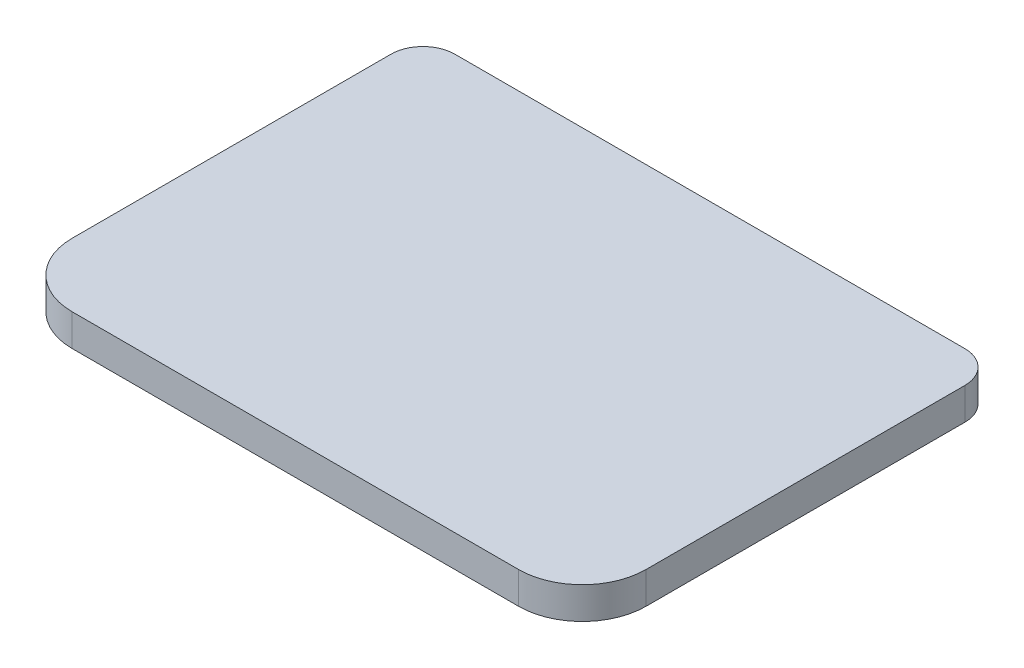
ISO-10303-21;
HEADER;
FILE_DESCRIPTION(('STEP AP214'),'2;1');
FILE_NAME('part.step','',(''),(''),'','','');
FILE_SCHEMA(('AUTOMOTIVE_DESIGN { 1 0 10303 214 1 1 1 1 }'));
ENDSEC;
DATA;
#1=APPLICATION_CONTEXT('core data for automotive mechanical design processes');
#2=APPLICATION_PROTOCOL_DEFINITION('international standard','automotive_design',2000,#1);
#3=PRODUCT_CONTEXT('',#1,'mechanical');
#4=PRODUCT('Part','Part','',(#3));
#5=PRODUCT_RELATED_PRODUCT_CATEGORY('part','',(#4));
#6=PRODUCT_DEFINITION_FORMATION('','',#4);
#7=PRODUCT_DEFINITION_CONTEXT('part definition',#1,'design');
#8=PRODUCT_DEFINITION('design','',#6,#7);
#9=PRODUCT_DEFINITION_SHAPE('','',#8);
#10=(LENGTH_UNIT() NAMED_UNIT(*) SI_UNIT(.MILLI.,.METRE.));
#11=(NAMED_UNIT(*) PLANE_ANGLE_UNIT() SI_UNIT($,.RADIAN.));
#12=(NAMED_UNIT(*) SI_UNIT($,.STERADIAN.) SOLID_ANGLE_UNIT());
#13=UNCERTAINTY_MEASURE_WITH_UNIT(LENGTH_MEASURE(1.E-05),#10,'distance_accuracy_value','');
#14=(GEOMETRIC_REPRESENTATION_CONTEXT(3) GLOBAL_UNCERTAINTY_ASSIGNED_CONTEXT((#13)) GLOBAL_UNIT_ASSIGNED_CONTEXT((#10,
#11,#12)) REPRESENTATION_CONTEXT('',''));
#15=CARTESIAN_POINT('',(0.,0.,0.));
#16=DIRECTION('',(0.,0.,1.));
#17=DIRECTION('',(1.,0.,0.));
#18=AXIS2_PLACEMENT_3D('',#15,#16,#17);
#19=CARTESIAN_POINT('',(28.575,3.175,-20.6375));
#20=DIRECTION('',(-1.,0.,0.));
#21=DIRECTION('',(0.,0.,1.));
#22=AXIS2_PLACEMENT_3D('',#19,#20,#21);
#23=PLANE('',#22);
#24=DIRECTION('',(0.,0.,-1.));
#25=VECTOR('',#24,1.);
#26=CARTESIAN_POINT('',(28.575,0.,-20.6375));
#27=LINE('',#26,#25);
#28=CARTESIAN_POINT('',(28.575,0.,14.2875));
#29=VERTEX_POINT('',#28);
#30=CARTESIAN_POINT('',(28.575,0.,-17.4625));
#31=VERTEX_POINT('',#30);
#32=EDGE_CURVE('E120',#29,#31,#27,.T.);
#33=ORIENTED_EDGE('',*,*,#32,.T.);
#34=DIRECTION('',(0.,-1.,0.));
#35=VECTOR('',#34,1.);
#36=CARTESIAN_POINT('',(28.575,3.175,-17.4625));
#37=LINE('',#36,#35);
#38=CARTESIAN_POINT('',(28.575,3.175,-17.4625));
#39=VERTEX_POINT('',#38);
#40=EDGE_CURVE('E62',#31,#39,#37,.F.);
#41=ORIENTED_EDGE('',*,*,#40,.T.);
#42=DIRECTION('',(0.,0.,-1.));
#43=VECTOR('',#42,1.);
#44=CARTESIAN_POINT('',(28.575,3.175,-20.6375));
#45=LINE('',#44,#43);
#46=CARTESIAN_POINT('',(28.575,3.175,14.2875));
#47=VERTEX_POINT('',#46);
#48=EDGE_CURVE('E121',#47,#39,#45,.T.);
#49=ORIENTED_EDGE('',*,*,#48,.F.);
#50=DIRECTION('',(0.,-1.,0.));
#51=VECTOR('',#50,1.);
#52=CARTESIAN_POINT('',(28.575,3.175,14.2875));
#53=LINE('',#52,#51);
#54=EDGE_CURVE('E111',#47,#29,#53,.T.);
#55=ORIENTED_EDGE('',*,*,#54,.T.);
#56=EDGE_LOOP('',(#33,#41,#49,#55));
#57=FACE_BOUND('',#56,.T.);
#58=ADVANCED_FACE('F39',(#57),#23,.F.);
#59=CARTESIAN_POINT('',(-28.575,3.175,-20.6375));
#60=DIRECTION('',(0.,0.,1.));
#61=DIRECTION('',(1.,0.,0.));
#62=AXIS2_PLACEMENT_3D('',#59,#60,#61);
#63=PLANE('',#62);
#64=DIRECTION('',(-1.,0.,0.));
#65=VECTOR('',#64,1.);
#66=CARTESIAN_POINT('',(-28.575,3.175,-20.6375));
#67=LINE('',#66,#65);
#68=CARTESIAN_POINT('',(25.4,3.175,-20.6375));
#69=VERTEX_POINT('',#68);
#70=CARTESIAN_POINT('',(-25.4,3.175,-20.6375));
#71=VERTEX_POINT('',#70);
#72=EDGE_CURVE('E162',#69,#71,#67,.T.);
#73=ORIENTED_EDGE('',*,*,#72,.F.);
#74=DIRECTION('',(0.,-1.,0.));
#75=VECTOR('',#74,1.);
#76=CARTESIAN_POINT('',(25.4,3.175,-20.6375));
#77=LINE('',#76,#75);
#78=CARTESIAN_POINT('',(25.4,0.,-20.6375));
#79=VERTEX_POINT('',#78);
#80=EDGE_CURVE('E152',#69,#79,#77,.T.);
#81=ORIENTED_EDGE('',*,*,#80,.T.);
#82=DIRECTION('',(-1.,0.,0.));
#83=VECTOR('',#82,1.);
#84=CARTESIAN_POINT('',(-28.575,0.,-20.6375));
#85=LINE('',#84,#83);
#86=CARTESIAN_POINT('',(-25.4,0.,-20.6375));
#87=VERTEX_POINT('',#86);
#88=EDGE_CURVE('E127',#79,#87,#85,.T.);
#89=ORIENTED_EDGE('',*,*,#88,.T.);
#90=DIRECTION('',(0.,-1.,0.));
#91=VECTOR('',#90,1.);
#92=CARTESIAN_POINT('',(-25.4,3.175,-20.6375));
#93=LINE('',#92,#91);
#94=EDGE_CURVE('E150',#87,#71,#93,.F.);
#95=ORIENTED_EDGE('',*,*,#94,.T.);
#96=EDGE_LOOP('',(#73,#81,#89,#95));
#97=FACE_BOUND('',#96,.T.);
#98=ADVANCED_FACE('F166',(#97),#63,.F.);
#99=CARTESIAN_POINT('',(-28.575,3.175,-20.6375));
#100=DIRECTION('',(1.,0.,0.));
#101=DIRECTION('',(0.,0.,-1.));
#102=AXIS2_PLACEMENT_3D('',#99,#100,#101);
#103=PLANE('',#102);
#104=DIRECTION('',(0.,0.,1.));
#105=VECTOR('',#104,1.);
#106=CARTESIAN_POINT('',(-28.575,3.175,-20.6375));
#107=LINE('',#106,#105);
#108=CARTESIAN_POINT('',(-28.575,3.175,-17.4625));
#109=VERTEX_POINT('',#108);
#110=CARTESIAN_POINT('',(-28.575,3.175,14.2875));
#111=VERTEX_POINT('',#110);
#112=EDGE_CURVE('E168',#109,#111,#107,.T.);
#113=ORIENTED_EDGE('',*,*,#112,.F.);
#114=DIRECTION('',(0.,-1.,0.));
#115=VECTOR('',#114,1.);
#116=CARTESIAN_POINT('',(-28.575,3.175,-17.4625));
#117=LINE('',#116,#115);
#118=CARTESIAN_POINT('',(-28.575,0.,-17.4625));
#119=VERTEX_POINT('',#118);
#120=EDGE_CURVE('E11',#109,#119,#117,.T.);
#121=ORIENTED_EDGE('',*,*,#120,.T.);
#122=DIRECTION('',(0.,0.,1.));
#123=VECTOR('',#122,1.);
#124=CARTESIAN_POINT('',(-28.575,0.,-20.6375));
#125=LINE('',#124,#123);
#126=CARTESIAN_POINT('',(-28.575,0.,14.2875));
#127=VERTEX_POINT('',#126);
#128=EDGE_CURVE('E130',#119,#127,#125,.T.);
#129=ORIENTED_EDGE('',*,*,#128,.T.);
#130=DIRECTION('',(0.,-1.,0.));
#131=VECTOR('',#130,1.);
#132=CARTESIAN_POINT('',(-28.575,3.175,14.2875));
#133=LINE('',#132,#131);
#134=EDGE_CURVE('E147',#127,#111,#133,.F.);
#135=ORIENTED_EDGE('',*,*,#134,.T.);
#136=EDGE_LOOP('',(#113,#121,#129,#135));
#137=FACE_BOUND('',#136,.T.);
#138=ADVANCED_FACE('F186',(#137),#103,.F.);
#139=CARTESIAN_POINT('',(-28.575,3.175,20.6375));
#140=DIRECTION('',(0.,0.,-1.));
#141=DIRECTION('',(-1.,0.,0.));
#142=AXIS2_PLACEMENT_3D('',#139,#140,#141);
#143=PLANE('',#142);
#144=DIRECTION('',(1.,0.,0.));
#145=VECTOR('',#144,1.);
#146=CARTESIAN_POINT('',(-28.575,0.,20.6375));
#147=LINE('',#146,#145);
#148=CARTESIAN_POINT('',(-22.225,0.,20.6375));
#149=VERTEX_POINT('',#148);
#150=CARTESIAN_POINT('',(22.225,0.,20.6375));
#151=VERTEX_POINT('',#150);
#152=EDGE_CURVE('E136',#149,#151,#147,.T.);
#153=ORIENTED_EDGE('',*,*,#152,.T.);
#154=DIRECTION('',(0.,-1.,0.));
#155=VECTOR('',#154,1.);
#156=CARTESIAN_POINT('',(22.225,3.175,20.6375));
#157=LINE('',#156,#155);
#158=CARTESIAN_POINT('',(22.225,3.175,20.6375));
#159=VERTEX_POINT('',#158);
#160=EDGE_CURVE('E112',#151,#159,#157,.F.);
#161=ORIENTED_EDGE('',*,*,#160,.T.);
#162=DIRECTION('',(1.,0.,0.));
#163=VECTOR('',#162,1.);
#164=CARTESIAN_POINT('',(-28.575,3.175,20.6375));
#165=LINE('',#164,#163);
#166=CARTESIAN_POINT('',(-22.225,3.175,20.6375));
#167=VERTEX_POINT('',#166);
#168=EDGE_CURVE('E122',#167,#159,#165,.T.);
#169=ORIENTED_EDGE('',*,*,#168,.F.);
#170=DIRECTION('',(0.,-1.,0.));
#171=VECTOR('',#170,1.);
#172=CARTESIAN_POINT('',(-22.225,3.175,20.6375));
#173=LINE('',#172,#171);
#174=EDGE_CURVE('E117',#167,#149,#173,.T.);
#175=ORIENTED_EDGE('',*,*,#174,.T.);
#176=EDGE_LOOP('',(#153,#161,#169,#175));
#177=FACE_BOUND('',#176,.T.);
#178=ADVANCED_FACE('F198',(#177),#143,.F.);
#179=CARTESIAN_POINT('',(0.,3.175,0.));
#180=DIRECTION('',(0.,1.,0.));
#181=DIRECTION('',(0.,0.,1.));
#182=AXIS2_PLACEMENT_3D('',#179,#180,#181);
#183=PLANE('',#182);
#184=ORIENTED_EDGE('',*,*,#48,.T.);
#185=CARTESIAN_POINT('',(25.4,3.175,-17.4625));
#186=DIRECTION('',(0.,1.,0.));
#187=DIRECTION('',(0.,0.,1.));
#188=AXIS2_PLACEMENT_3D('',#185,#186,#187);
#189=CIRCLE('',#188,3.175);
#190=EDGE_CURVE('E47',#39,#69,#189,.T.);
#191=ORIENTED_EDGE('',*,*,#190,.T.);
#192=ORIENTED_EDGE('',*,*,#72,.T.);
#193=CARTESIAN_POINT('',(-25.4,3.175,-17.4625));
#194=DIRECTION('',(0.,1.,0.));
#195=DIRECTION('',(0.,0.,1.));
#196=AXIS2_PLACEMENT_3D('',#193,#194,#195);
#197=CIRCLE('',#196,3.175);
#198=EDGE_CURVE('E54',#71,#109,#197,.T.);
#199=ORIENTED_EDGE('',*,*,#198,.T.);
#200=ORIENTED_EDGE('',*,*,#112,.T.);
#201=CARTESIAN_POINT('',(-22.225,3.175,14.2875));
#202=DIRECTION('',(0.,1.,0.));
#203=DIRECTION('',(0.,0.,1.));
#204=AXIS2_PLACEMENT_3D('',#201,#202,#203);
#205=CIRCLE('',#204,6.35);
#206=EDGE_CURVE('E143',#111,#167,#205,.T.);
#207=ORIENTED_EDGE('',*,*,#206,.T.);
#208=ORIENTED_EDGE('',*,*,#168,.T.);
#209=CARTESIAN_POINT('',(22.225,3.175,14.2875));
#210=DIRECTION('',(0.,1.,0.));
#211=DIRECTION('',(0.,0.,1.));
#212=AXIS2_PLACEMENT_3D('',#209,#210,#211);
#213=CIRCLE('',#212,6.35);
#214=EDGE_CURVE('E145',#159,#47,#213,.T.);
#215=ORIENTED_EDGE('',*,*,#214,.T.);
#216=EDGE_LOOP('',(#184,#191,#192,#199,#200,#207,#208,#215));
#217=FACE_BOUND('',#216,.T.);
#218=ADVANCED_FACE('F161',(#217),#183,.T.);
#219=CARTESIAN_POINT('',(0.,0.,0.));
#220=DIRECTION('',(0.,1.,0.));
#221=DIRECTION('',(0.,0.,1.));
#222=AXIS2_PLACEMENT_3D('',#219,#220,#221);
#223=PLANE('',#222);
#224=ORIENTED_EDGE('',*,*,#88,.F.);
#225=CARTESIAN_POINT('',(25.4,0.,-17.4625));
#226=DIRECTION('',(0.,1.,0.));
#227=DIRECTION('',(0.,0.,1.));
#228=AXIS2_PLACEMENT_3D('',#225,#226,#227);
#229=CIRCLE('',#228,3.175);
#230=EDGE_CURVE('E126',#79,#31,#229,.F.);
#231=ORIENTED_EDGE('',*,*,#230,.T.);
#232=ORIENTED_EDGE('',*,*,#32,.F.);
#233=CARTESIAN_POINT('',(22.225,0.,14.2875));
#234=DIRECTION('',(0.,1.,0.));
#235=DIRECTION('',(0.,0.,1.));
#236=AXIS2_PLACEMENT_3D('',#233,#234,#235);
#237=CIRCLE('',#236,6.35);
#238=EDGE_CURVE('E107',#29,#151,#237,.F.);
#239=ORIENTED_EDGE('',*,*,#238,.T.);
#240=ORIENTED_EDGE('',*,*,#152,.F.);
#241=CARTESIAN_POINT('',(-22.225,0.,14.2875));
#242=DIRECTION('',(0.,1.,0.));
#243=DIRECTION('',(0.,0.,1.));
#244=AXIS2_PLACEMENT_3D('',#241,#242,#243);
#245=CIRCLE('',#244,6.35);
#246=EDGE_CURVE('E118',#149,#127,#245,.F.);
#247=ORIENTED_EDGE('',*,*,#246,.T.);
#248=ORIENTED_EDGE('',*,*,#128,.F.);
#249=CARTESIAN_POINT('',(-25.4,0.,-17.4625));
#250=DIRECTION('',(0.,1.,0.));
#251=DIRECTION('',(0.,0.,1.));
#252=AXIS2_PLACEMENT_3D('',#249,#250,#251);
#253=CIRCLE('',#252,3.175);
#254=EDGE_CURVE('E155',#119,#87,#253,.F.);
#255=ORIENTED_EDGE('',*,*,#254,.T.);
#256=EDGE_LOOP('',(#224,#231,#232,#239,#240,#247,#248,#255));
#257=FACE_BOUND('',#256,.T.);
#258=ADVANCED_FACE('F125',(#257),#223,.F.);
#259=CARTESIAN_POINT('',(22.225,3.175,14.2875));
#260=DIRECTION('',(0.,-1.,0.));
#261=DIRECTION('',(0.,0.,-1.));
#262=AXIS2_PLACEMENT_3D('',#259,#260,#261);
#263=CYLINDRICAL_SURFACE('',#262,6.35);
#264=ORIENTED_EDGE('',*,*,#214,.F.);
#265=ORIENTED_EDGE('',*,*,#160,.F.);
#266=ORIENTED_EDGE('',*,*,#238,.F.);
#267=ORIENTED_EDGE('',*,*,#54,.F.);
#268=EDGE_LOOP('',(#264,#265,#266,#267));
#269=FACE_BOUND('',#268,.T.);
#270=ADVANCED_FACE('F110',(#269),#263,.T.);
#271=CARTESIAN_POINT('',(-22.225,3.175,14.2875));
#272=DIRECTION('',(0.,-1.,0.));
#273=DIRECTION('',(0.,0.,-1.));
#274=AXIS2_PLACEMENT_3D('',#271,#272,#273);
#275=CYLINDRICAL_SURFACE('',#274,6.35);
#276=ORIENTED_EDGE('',*,*,#206,.F.);
#277=ORIENTED_EDGE('',*,*,#134,.F.);
#278=ORIENTED_EDGE('',*,*,#246,.F.);
#279=ORIENTED_EDGE('',*,*,#174,.F.);
#280=EDGE_LOOP('',(#276,#277,#278,#279));
#281=FACE_BOUND('',#280,.T.);
#282=ADVANCED_FACE('F172',(#281),#275,.T.);
#283=CARTESIAN_POINT('',(25.4,3.175,-17.4625));
#284=DIRECTION('',(0.,-1.,0.));
#285=DIRECTION('',(0.,0.,-1.));
#286=AXIS2_PLACEMENT_3D('',#283,#284,#285);
#287=CYLINDRICAL_SURFACE('',#286,3.175);
#288=ORIENTED_EDGE('',*,*,#190,.F.);
#289=ORIENTED_EDGE('',*,*,#40,.F.);
#290=ORIENTED_EDGE('',*,*,#230,.F.);
#291=ORIENTED_EDGE('',*,*,#80,.F.);
#292=EDGE_LOOP('',(#288,#289,#290,#291));
#293=FACE_BOUND('',#292,.T.);
#294=ADVANCED_FACE('F170',(#293),#287,.T.);
#295=CARTESIAN_POINT('',(-25.4,3.175,-17.4625));
#296=DIRECTION('',(0.,-1.,0.));
#297=DIRECTION('',(0.,0.,-1.));
#298=AXIS2_PLACEMENT_3D('',#295,#296,#297);
#299=CYLINDRICAL_SURFACE('',#298,3.175);
#300=ORIENTED_EDGE('',*,*,#198,.F.);
#301=ORIENTED_EDGE('',*,*,#94,.F.);
#302=ORIENTED_EDGE('',*,*,#254,.F.);
#303=ORIENTED_EDGE('',*,*,#120,.F.);
#304=EDGE_LOOP('',(#300,#301,#302,#303));
#305=FACE_BOUND('',#304,.T.);
#306=ADVANCED_FACE('F41',(#305),#299,.T.);
#307=CLOSED_SHELL('',(#58,#98,#138,#178,#218,#258,#270,#282,#294,#306));
#308=MANIFOLD_SOLID_BREP('B2',#307);
#309=ADVANCED_BREP_SHAPE_REPRESENTATION('',(#18,#308),#14);
#310=SHAPE_DEFINITION_REPRESENTATION(#9,#309);
ENDSEC;
END-ISO-10303-21;
